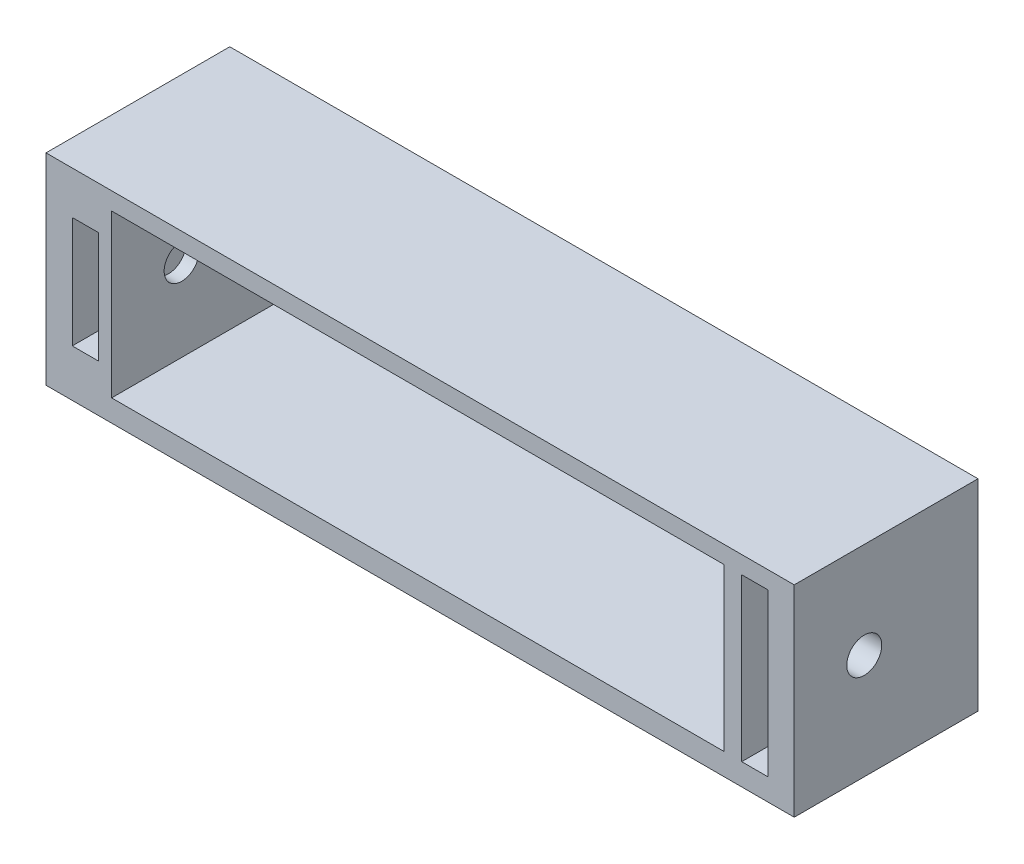
ISO-10303-21;
HEADER;
FILE_DESCRIPTION(('STEP AP214'),'2;1');
FILE_NAME('part.step','',(''),(''),'','','');
FILE_SCHEMA(('AUTOMOTIVE_DESIGN { 1 0 10303 214 1 1 1 1 }'));
ENDSEC;
DATA;
#1=APPLICATION_CONTEXT('core data for automotive mechanical design processes');
#2=APPLICATION_PROTOCOL_DEFINITION('international standard','automotive_design',2000,#1);
#3=PRODUCT_CONTEXT('',#1,'mechanical');
#4=PRODUCT('Part','Part','',(#3));
#5=PRODUCT_RELATED_PRODUCT_CATEGORY('part','',(#4));
#6=PRODUCT_DEFINITION_FORMATION('','',#4);
#7=PRODUCT_DEFINITION_CONTEXT('part definition',#1,'design');
#8=PRODUCT_DEFINITION('design','',#6,#7);
#9=PRODUCT_DEFINITION_SHAPE('','',#8);
#10=(LENGTH_UNIT() NAMED_UNIT(*) SI_UNIT(.MILLI.,.METRE.));
#11=(NAMED_UNIT(*) PLANE_ANGLE_UNIT() SI_UNIT($,.RADIAN.));
#12=(NAMED_UNIT(*) SI_UNIT($,.STERADIAN.) SOLID_ANGLE_UNIT());
#13=UNCERTAINTY_MEASURE_WITH_UNIT(LENGTH_MEASURE(1.E-05),#10,'distance_accuracy_value','');
#14=(GEOMETRIC_REPRESENTATION_CONTEXT(3) GLOBAL_UNCERTAINTY_ASSIGNED_CONTEXT((#13)) GLOBAL_UNIT_ASSIGNED_CONTEXT((#10,
#11,#12)) REPRESENTATION_CONTEXT('',''));
#15=CARTESIAN_POINT('',(0.,0.,0.));
#16=DIRECTION('',(0.,0.,1.));
#17=DIRECTION('',(1.,0.,0.));
#18=AXIS2_PLACEMENT_3D('',#15,#16,#17);
#19=CARTESIAN_POINT('',(34.5,0.,19.));
#20=DIRECTION('',(1.,0.,0.));
#21=DIRECTION('',(0.,0.,-1.));
#22=AXIS2_PLACEMENT_3D('',#19,#20,#21);
#23=PLANE('',#22);
#24=CARTESIAN_POINT('',(34.5,0.282979522502771,11.));
#25=DIRECTION('',(1.,0.,0.));
#26=DIRECTION('',(0.,0.,-1.));
#27=AXIS2_PLACEMENT_3D('',#24,#25,#26);
#28=CIRCLE('',#27,2.);
#29=CARTESIAN_POINT('',(34.5,0.282979522502771,9.));
#30=VERTEX_POINT('',#29);
#31=EDGE_CURVE('E349',#30,#30,#28,.T.);
#32=ORIENTED_EDGE('',*,*,#31,.F.);
#33=EDGE_LOOP('',(#32));
#34=FACE_BOUND('',#33,.T.);
#35=DIRECTION('',(0.,-1.,0.));
#36=VECTOR('',#35,1.);
#37=CARTESIAN_POINT('',(34.5,0.,0.));
#38=LINE('',#37,#36);
#39=CARTESIAN_POINT('',(34.5,9.25000000000001,0.));
#40=VERTEX_POINT('',#39);
#41=CARTESIAN_POINT('',(34.5,-9.25,0.));
#42=VERTEX_POINT('',#41);
#43=EDGE_CURVE('E186',#40,#42,#38,.T.);
#44=ORIENTED_EDGE('',*,*,#43,.F.);
#45=DIRECTION('',(0.,0.,-1.));
#46=VECTOR('',#45,1.);
#47=CARTESIAN_POINT('',(34.5,9.25000000000001,19.));
#48=LINE('',#47,#46);
#49=CARTESIAN_POINT('',(34.5,9.25000000000001,19.));
#50=VERTEX_POINT('',#49);
#51=EDGE_CURVE('E11',#50,#40,#48,.T.);
#52=ORIENTED_EDGE('',*,*,#51,.F.);
#53=DIRECTION('',(0.,-1.,0.));
#54=VECTOR('',#53,1.);
#55=CARTESIAN_POINT('',(34.5,0.,19.));
#56=LINE('',#55,#54);
#57=CARTESIAN_POINT('',(34.5,-9.25,19.));
#58=VERTEX_POINT('',#57);
#59=EDGE_CURVE('E149',#50,#58,#56,.T.);
#60=ORIENTED_EDGE('',*,*,#59,.T.);
#61=DIRECTION('',(0.,0.,-1.));
#62=VECTOR('',#61,1.);
#63=CARTESIAN_POINT('',(34.5,-9.25,19.));
#64=LINE('',#63,#62);
#65=EDGE_CURVE('E87',#58,#42,#64,.T.);
#66=ORIENTED_EDGE('',*,*,#65,.T.);
#67=EDGE_LOOP('',(#44,#52,#60,#66));
#68=FACE_BOUND('',#67,.T.);
#69=ADVANCED_FACE('F35',(#34,#68),#23,.T.);
#70=CARTESIAN_POINT('',(0.,9.25000000000001,19.));
#71=DIRECTION('',(0.,-1.,0.));
#72=DIRECTION('',(1.,0.,0.));
#73=AXIS2_PLACEMENT_3D('',#70,#71,#72);
#74=PLANE('',#73);
#75=DIRECTION('',(-1.,0.,0.));
#76=VECTOR('',#75,1.);
#77=CARTESIAN_POINT('',(0.,9.25000000000001,0.));
#78=LINE('',#77,#76);
#79=CARTESIAN_POINT('',(37.5,9.25000000000002,0.));
#80=VERTEX_POINT('',#79);
#81=EDGE_CURVE('E142',#80,#40,#78,.T.);
#82=ORIENTED_EDGE('',*,*,#81,.F.);
#83=DIRECTION('',(0.,0.,-1.));
#84=VECTOR('',#83,1.);
#85=CARTESIAN_POINT('',(37.5,9.25000000000002,19.));
#86=LINE('',#85,#84);
#87=CARTESIAN_POINT('',(37.5,9.25000000000002,19.));
#88=VERTEX_POINT('',#87);
#89=EDGE_CURVE('E45',#88,#80,#86,.T.);
#90=ORIENTED_EDGE('',*,*,#89,.F.);
#91=DIRECTION('',(-1.,0.,0.));
#92=VECTOR('',#91,1.);
#93=CARTESIAN_POINT('',(0.,9.25000000000001,19.));
#94=LINE('',#93,#92);
#95=EDGE_CURVE('E140',#88,#50,#94,.T.);
#96=ORIENTED_EDGE('',*,*,#95,.T.);
#97=ORIENTED_EDGE('',*,*,#51,.T.);
#98=EDGE_LOOP('',(#82,#90,#96,#97));
#99=FACE_BOUND('',#98,.T.);
#100=ADVANCED_FACE('F139',(#99),#74,.T.);
#101=CARTESIAN_POINT('',(37.5,0.,19.));
#102=DIRECTION('',(-1.,0.,0.));
#103=DIRECTION('',(0.,0.,1.));
#104=AXIS2_PLACEMENT_3D('',#101,#102,#103);
#105=PLANE('',#104);
#106=CARTESIAN_POINT('',(37.5,0.282979522502771,11.));
#107=DIRECTION('',(-1.,0.,0.));
#108=DIRECTION('',(0.,0.,1.));
#109=AXIS2_PLACEMENT_3D('',#106,#107,#108);
#110=CIRCLE('',#109,2.);
#111=CARTESIAN_POINT('',(37.5,0.282979522502771,13.));
#112=VERTEX_POINT('',#111);
#113=EDGE_CURVE('E346',#112,#112,#110,.T.);
#114=ORIENTED_EDGE('',*,*,#113,.F.);
#115=EDGE_LOOP('',(#114));
#116=FACE_BOUND('',#115,.T.);
#117=DIRECTION('',(0.,1.,0.));
#118=VECTOR('',#117,1.);
#119=CARTESIAN_POINT('',(37.5,0.,0.));
#120=LINE('',#119,#118);
#121=CARTESIAN_POINT('',(37.5,-9.25,0.));
#122=VERTEX_POINT('',#121);
#123=EDGE_CURVE('E189',#122,#80,#120,.T.);
#124=ORIENTED_EDGE('',*,*,#123,.F.);
#125=DIRECTION('',(0.,0.,-1.));
#126=VECTOR('',#125,1.);
#127=CARTESIAN_POINT('',(37.5,-9.25,19.));
#128=LINE('',#127,#126);
#129=CARTESIAN_POINT('',(37.5,-9.25,19.));
#130=VERTEX_POINT('',#129);
#131=EDGE_CURVE('E80',#130,#122,#128,.T.);
#132=ORIENTED_EDGE('',*,*,#131,.F.);
#133=DIRECTION('',(0.,1.,0.));
#134=VECTOR('',#133,1.);
#135=CARTESIAN_POINT('',(37.5,0.,19.));
#136=LINE('',#135,#134);
#137=EDGE_CURVE('E148',#130,#88,#136,.T.);
#138=ORIENTED_EDGE('',*,*,#137,.T.);
#139=ORIENTED_EDGE('',*,*,#89,.T.);
#140=EDGE_LOOP('',(#124,#132,#138,#139));
#141=FACE_BOUND('',#140,.T.);
#142=ADVANCED_FACE('F152',(#116,#141),#105,.T.);
#143=CARTESIAN_POINT('',(-45.,0.,19.));
#144=DIRECTION('',(-1.,0.,0.));
#145=DIRECTION('',(0.,-1.,0.));
#146=AXIS2_PLACEMENT_3D('',#143,#144,#145);
#147=PLANE('',#146);
#148=CARTESIAN_POINT('',(-45.,0.282979522502771,11.));
#149=DIRECTION('',(-1.,0.,0.));
#150=DIRECTION('',(0.,-1.,0.));
#151=AXIS2_PLACEMENT_3D('',#148,#149,#150);
#152=CIRCLE('',#151,2.);
#153=CARTESIAN_POINT('',(-45.,-1.71702047749723,11.));
#154=VERTEX_POINT('',#153);
#155=EDGE_CURVE('E338',#154,#154,#152,.T.);
#156=ORIENTED_EDGE('',*,*,#155,.F.);
#157=EDGE_LOOP('',(#156));
#158=FACE_BOUND('',#157,.T.);
#159=DIRECTION('',(0.,0.,-1.));
#160=VECTOR('',#159,1.);
#161=CARTESIAN_POINT('',(-45.,11.25,19.));
#162=LINE('',#161,#160);
#163=CARTESIAN_POINT('',(-45.,11.25,19.));
#164=VERTEX_POINT('',#163);
#165=CARTESIAN_POINT('',(-45.,11.25,-2.));
#166=VERTEX_POINT('',#165);
#167=EDGE_CURVE('E194',#164,#166,#162,.T.);
#168=ORIENTED_EDGE('',*,*,#167,.T.);
#169=DIRECTION('',(0.,1.,0.));
#170=VECTOR('',#169,1.);
#171=CARTESIAN_POINT('',(-45.,11.25,-2.));
#172=LINE('',#171,#170);
#173=CARTESIAN_POINT('',(-45.,-11.75,-2.));
#174=VERTEX_POINT('',#173);
#175=EDGE_CURVE('E358',#174,#166,#172,.T.);
#176=ORIENTED_EDGE('',*,*,#175,.F.);
#177=DIRECTION('',(0.,0.,-1.));
#178=VECTOR('',#177,1.);
#179=CARTESIAN_POINT('',(-45.,-11.75,19.));
#180=LINE('',#179,#178);
#181=CARTESIAN_POINT('',(-45.,-11.75,19.));
#182=VERTEX_POINT('',#181);
#183=EDGE_CURVE('E192',#182,#174,#180,.T.);
#184=ORIENTED_EDGE('',*,*,#183,.F.);
#185=DIRECTION('',(0.,1.,0.));
#186=VECTOR('',#185,1.);
#187=CARTESIAN_POINT('',(-45.,0.,19.));
#188=LINE('',#187,#186);
#189=EDGE_CURVE('E256',#182,#164,#188,.T.);
#190=ORIENTED_EDGE('',*,*,#189,.T.);
#191=EDGE_LOOP('',(#168,#176,#184,#190));
#192=FACE_BOUND('',#191,.T.);
#193=ADVANCED_FACE('F313',(#158,#192),#147,.T.);
#194=CARTESIAN_POINT('',(0.,-11.75,19.));
#195=DIRECTION('',(0.,-1.,0.));
#196=DIRECTION('',(0.,0.,-1.));
#197=AXIS2_PLACEMENT_3D('',#194,#195,#196);
#198=PLANE('',#197);
#199=ORIENTED_EDGE('',*,*,#183,.T.);
#200=DIRECTION('',(-1.,0.,0.));
#201=VECTOR('',#200,1.);
#202=CARTESIAN_POINT('',(40.5,-11.75,-2.));
#203=LINE('',#202,#201);
#204=CARTESIAN_POINT('',(40.5,-11.75,-2.));
#205=VERTEX_POINT('',#204);
#206=EDGE_CURVE('E355',#205,#174,#203,.T.);
#207=ORIENTED_EDGE('',*,*,#206,.F.);
#208=DIRECTION('',(0.,0.,-1.));
#209=VECTOR('',#208,1.);
#210=CARTESIAN_POINT('',(40.5,-11.75,19.));
#211=LINE('',#210,#209);
#212=CARTESIAN_POINT('',(40.5,-11.75,19.));
#213=VERTEX_POINT('',#212);
#214=EDGE_CURVE('E201',#213,#205,#211,.T.);
#215=ORIENTED_EDGE('',*,*,#214,.F.);
#216=DIRECTION('',(-1.,0.,0.));
#217=VECTOR('',#216,1.);
#218=CARTESIAN_POINT('',(0.,-11.75,19.));
#219=LINE('',#218,#217);
#220=EDGE_CURVE('E259',#213,#182,#219,.T.);
#221=ORIENTED_EDGE('',*,*,#220,.T.);
#222=EDGE_LOOP('',(#199,#207,#215,#221));
#223=FACE_BOUND('',#222,.T.);
#224=ADVANCED_FACE('F309',(#223),#198,.T.);
#225=CARTESIAN_POINT('',(40.5,0.,19.));
#226=DIRECTION('',(-1.,0.,0.));
#227=DIRECTION('',(0.,0.,1.));
#228=AXIS2_PLACEMENT_3D('',#225,#226,#227);
#229=PLANE('',#228);
#230=CARTESIAN_POINT('',(40.5,0.282979522502771,11.));
#231=DIRECTION('',(1.,0.,0.));
#232=DIRECTION('',(0.,0.,-1.));
#233=AXIS2_PLACEMENT_3D('',#230,#231,#232);
#234=CIRCLE('',#233,2.);
#235=CARTESIAN_POINT('',(40.5,0.282979522502771,9.));
#236=VERTEX_POINT('',#235);
#237=EDGE_CURVE('E549',#236,#236,#234,.T.);
#238=ORIENTED_EDGE('',*,*,#237,.F.);
#239=EDGE_LOOP('',(#238));
#240=FACE_BOUND('',#239,.T.);
#241=ORIENTED_EDGE('',*,*,#214,.T.);
#242=DIRECTION('',(0.,-1.,0.));
#243=VECTOR('',#242,1.);
#244=CARTESIAN_POINT('',(40.5,11.25,-2.));
#245=LINE('',#244,#243);
#246=CARTESIAN_POINT('',(40.5,11.25,-2.));
#247=VERTEX_POINT('',#246);
#248=EDGE_CURVE('E352',#247,#205,#245,.T.);
#249=ORIENTED_EDGE('',*,*,#248,.F.);
#250=DIRECTION('',(0.,0.,-1.));
#251=VECTOR('',#250,1.);
#252=CARTESIAN_POINT('',(40.5,11.25,19.));
#253=LINE('',#252,#251);
#254=CARTESIAN_POINT('',(40.5,11.25,19.));
#255=VERTEX_POINT('',#254);
#256=EDGE_CURVE('E197',#255,#247,#253,.T.);
#257=ORIENTED_EDGE('',*,*,#256,.F.);
#258=DIRECTION('',(0.,1.,0.));
#259=VECTOR('',#258,1.);
#260=CARTESIAN_POINT('',(40.5,0.,19.));
#261=LINE('',#260,#259);
#262=EDGE_CURVE('E262',#213,#255,#261,.T.);
#263=ORIENTED_EDGE('',*,*,#262,.F.);
#264=EDGE_LOOP('',(#241,#249,#257,#263));
#265=FACE_BOUND('',#264,.T.);
#266=ADVANCED_FACE('F306',(#240,#265),#229,.F.);
#267=CARTESIAN_POINT('',(32.5,9.25000000000001,0.));
#268=VERTEX_POINT('',#267);
#269=CARTESIAN_POINT('',(-37.5,9.25000000000001,0.));
#270=VERTEX_POINT('',#269);
#271=EDGE_CURVE('E173',#268,#270,#78,.T.);
#272=ORIENTED_EDGE('',*,*,#271,.F.);
#273=DIRECTION('',(0.,0.,-1.));
#274=VECTOR('',#273,1.);
#275=CARTESIAN_POINT('',(32.5,9.25000000000001,19.));
#276=LINE('',#275,#274);
#277=CARTESIAN_POINT('',(32.5,9.25000000000001,19.));
#278=VERTEX_POINT('',#277);
#279=EDGE_CURVE('E198',#278,#268,#276,.T.);
#280=ORIENTED_EDGE('',*,*,#279,.F.);
#281=CARTESIAN_POINT('',(-37.5,9.25000000000001,19.));
#282=VERTEX_POINT('',#281);
#283=EDGE_CURVE('E151',#278,#282,#94,.T.);
#284=ORIENTED_EDGE('',*,*,#283,.T.);
#285=DIRECTION('',(0.,0.,-1.));
#286=VECTOR('',#285,1.);
#287=CARTESIAN_POINT('',(-37.5,9.25000000000001,19.));
#288=LINE('',#287,#286);
#289=EDGE_CURVE('E206',#282,#270,#288,.T.);
#290=ORIENTED_EDGE('',*,*,#289,.T.);
#291=EDGE_LOOP('',(#272,#280,#284,#290));
#292=FACE_BOUND('',#291,.T.);
#293=ADVANCED_FACE('F299',(#292),#74,.T.);
#294=CARTESIAN_POINT('',(32.5,0.,19.));
#295=DIRECTION('',(1.,0.,0.));
#296=DIRECTION('',(0.,1.,0.));
#297=AXIS2_PLACEMENT_3D('',#294,#295,#296);
#298=PLANE('',#297);
#299=CARTESIAN_POINT('',(32.5,0.282979522502771,11.));
#300=DIRECTION('',(1.,0.,0.));
#301=DIRECTION('',(0.,1.,0.));
#302=AXIS2_PLACEMENT_3D('',#299,#300,#301);
#303=CIRCLE('',#302,2.);
#304=CARTESIAN_POINT('',(32.5,2.28297952250277,11.));
#305=VERTEX_POINT('',#304);
#306=EDGE_CURVE('E334',#305,#305,#303,.T.);
#307=ORIENTED_EDGE('',*,*,#306,.T.);
#308=EDGE_LOOP('',(#307));
#309=FACE_BOUND('',#308,.T.);
#310=DIRECTION('',(0.,-1.,0.));
#311=VECTOR('',#310,1.);
#312=CARTESIAN_POINT('',(32.5,0.,0.));
#313=LINE('',#312,#311);
#314=CARTESIAN_POINT('',(32.5,-9.25,0.));
#315=VERTEX_POINT('',#314);
#316=EDGE_CURVE('E176',#268,#315,#313,.T.);
#317=ORIENTED_EDGE('',*,*,#316,.T.);
#318=DIRECTION('',(0.,0.,-1.));
#319=VECTOR('',#318,1.);
#320=CARTESIAN_POINT('',(32.5,-9.25,19.));
#321=LINE('',#320,#319);
#322=CARTESIAN_POINT('',(32.5,-9.25,19.));
#323=VERTEX_POINT('',#322);
#324=EDGE_CURVE('E212',#323,#315,#321,.T.);
#325=ORIENTED_EDGE('',*,*,#324,.F.);
#326=DIRECTION('',(0.,-1.,0.));
#327=VECTOR('',#326,1.);
#328=CARTESIAN_POINT('',(32.5,0.,19.));
#329=LINE('',#328,#327);
#330=EDGE_CURVE('E250',#278,#323,#329,.T.);
#331=ORIENTED_EDGE('',*,*,#330,.F.);
#332=ORIENTED_EDGE('',*,*,#279,.T.);
#333=EDGE_LOOP('',(#317,#325,#331,#332));
#334=FACE_BOUND('',#333,.T.);
#335=ADVANCED_FACE('F290',(#309,#334),#298,.F.);
#336=CARTESIAN_POINT('',(0.,-9.25000000000001,19.));
#337=DIRECTION('',(0.,-1.,0.));
#338=DIRECTION('',(1.,0.,0.));
#339=AXIS2_PLACEMENT_3D('',#336,#337,#338);
#340=PLANE('',#339);
#341=DIRECTION('',(-1.,0.,0.));
#342=VECTOR('',#341,1.);
#343=CARTESIAN_POINT('',(0.,-9.25000000000001,0.));
#344=LINE('',#343,#342);
#345=CARTESIAN_POINT('',(-37.5,-9.25000000000001,0.));
#346=VERTEX_POINT('',#345);
#347=EDGE_CURVE('E179',#315,#346,#344,.T.);
#348=ORIENTED_EDGE('',*,*,#347,.T.);
#349=DIRECTION('',(0.,0.,-1.));
#350=VECTOR('',#349,1.);
#351=CARTESIAN_POINT('',(-37.5,-9.25000000000001,19.));
#352=LINE('',#351,#350);
#353=CARTESIAN_POINT('',(-37.5,-9.25000000000001,19.));
#354=VERTEX_POINT('',#353);
#355=EDGE_CURVE('E209',#354,#346,#352,.T.);
#356=ORIENTED_EDGE('',*,*,#355,.F.);
#357=DIRECTION('',(-1.,0.,0.));
#358=VECTOR('',#357,1.);
#359=CARTESIAN_POINT('',(0.,-9.25000000000001,19.));
#360=LINE('',#359,#358);
#361=EDGE_CURVE('E156',#323,#354,#360,.T.);
#362=ORIENTED_EDGE('',*,*,#361,.F.);
#363=ORIENTED_EDGE('',*,*,#324,.T.);
#364=EDGE_LOOP('',(#348,#356,#362,#363));
#365=FACE_BOUND('',#364,.T.);
#366=ADVANCED_FACE('F279',(#365),#340,.F.);
#367=CARTESIAN_POINT('',(0.,6.3557213930348,19.));
#368=DIRECTION('',(0.,-1.,0.));
#369=DIRECTION('',(1.,0.,0.));
#370=AXIS2_PLACEMENT_3D('',#367,#368,#369);
#371=PLANE('',#370);
#372=DIRECTION('',(-1.,0.,0.));
#373=VECTOR('',#372,1.);
#374=CARTESIAN_POINT('',(0.,6.3557213930348,0.));
#375=LINE('',#374,#373);
#376=CARTESIAN_POINT('',(-39.,6.35572139303481,0.));
#377=VERTEX_POINT('',#376);
#378=CARTESIAN_POINT('',(-42.,6.35572139303481,0.));
#379=VERTEX_POINT('',#378);
#380=EDGE_CURVE('E160',#377,#379,#375,.T.);
#381=ORIENTED_EDGE('',*,*,#380,.F.);
#382=DIRECTION('',(0.,0.,-1.));
#383=VECTOR('',#382,1.);
#384=CARTESIAN_POINT('',(-39.,6.35572139303481,19.));
#385=LINE('',#384,#383);
#386=CARTESIAN_POINT('',(-39.,6.35572139303481,19.));
#387=VERTEX_POINT('',#386);
#388=EDGE_CURVE('E95',#387,#377,#385,.T.);
#389=ORIENTED_EDGE('',*,*,#388,.F.);
#390=DIRECTION('',(-1.,0.,0.));
#391=VECTOR('',#390,1.);
#392=CARTESIAN_POINT('',(0.,6.3557213930348,19.));
#393=LINE('',#392,#391);
#394=CARTESIAN_POINT('',(-42.,6.35572139303481,19.));
#395=VERTEX_POINT('',#394);
#396=EDGE_CURVE('E243',#387,#395,#393,.T.);
#397=ORIENTED_EDGE('',*,*,#396,.T.);
#398=DIRECTION('',(0.,0.,-1.));
#399=VECTOR('',#398,1.);
#400=CARTESIAN_POINT('',(-42.,6.35572139303481,19.));
#401=LINE('',#400,#399);
#402=EDGE_CURVE('E154',#395,#379,#401,.T.);
#403=ORIENTED_EDGE('',*,*,#402,.T.);
#404=EDGE_LOOP('',(#381,#389,#397,#403));
#405=FACE_BOUND('',#404,.T.);
#406=ADVANCED_FACE('F37',(#405),#371,.T.);
#407=CARTESIAN_POINT('',(-39.,0.,19.));
#408=DIRECTION('',(-1.,0.,0.));
#409=DIRECTION('',(0.,0.,1.));
#410=AXIS2_PLACEMENT_3D('',#407,#408,#409);
#411=PLANE('',#410);
#412=CARTESIAN_POINT('',(-39.,0.282979522502771,11.));
#413=DIRECTION('',(-1.,0.,0.));
#414=DIRECTION('',(0.,0.,1.));
#415=AXIS2_PLACEMENT_3D('',#412,#413,#414);
#416=CIRCLE('',#415,2.);
#417=CARTESIAN_POINT('',(-39.,0.282979522502771,13.));
#418=VERTEX_POINT('',#417);
#419=EDGE_CURVE('E332',#418,#418,#416,.T.);
#420=ORIENTED_EDGE('',*,*,#419,.F.);
#421=EDGE_LOOP('',(#420));
#422=FACE_BOUND('',#421,.T.);
#423=DIRECTION('',(0.,1.,0.));
#424=VECTOR('',#423,1.);
#425=CARTESIAN_POINT('',(-39.,0.,0.));
#426=LINE('',#425,#424);
#427=CARTESIAN_POINT('',(-39.,-6.35572139303481,0.));
#428=VERTEX_POINT('',#427);
#429=EDGE_CURVE('E163',#428,#377,#426,.T.);
#430=ORIENTED_EDGE('',*,*,#429,.F.);
#431=DIRECTION('',(0.,0.,-1.));
#432=VECTOR('',#431,1.);
#433=CARTESIAN_POINT('',(-39.,-6.35572139303481,19.));
#434=LINE('',#433,#432);
#435=CARTESIAN_POINT('',(-39.,-6.35572139303481,19.));
#436=VERTEX_POINT('',#435);
#437=EDGE_CURVE('E220',#436,#428,#434,.T.);
#438=ORIENTED_EDGE('',*,*,#437,.F.);
#439=DIRECTION('',(0.,1.,0.));
#440=VECTOR('',#439,1.);
#441=CARTESIAN_POINT('',(-39.,0.,19.));
#442=LINE('',#441,#440);
#443=EDGE_CURVE('E227',#436,#387,#442,.T.);
#444=ORIENTED_EDGE('',*,*,#443,.T.);
#445=ORIENTED_EDGE('',*,*,#388,.T.);
#446=EDGE_LOOP('',(#430,#438,#444,#445));
#447=FACE_BOUND('',#446,.T.);
#448=ADVANCED_FACE('F224',(#422,#447),#411,.T.);
#449=CARTESIAN_POINT('',(0.,-6.35572139303481,19.));
#450=DIRECTION('',(0.,-1.,0.));
#451=DIRECTION('',(0.,0.,-1.));
#452=AXIS2_PLACEMENT_3D('',#449,#450,#451);
#453=PLANE('',#452);
#454=DIRECTION('',(-1.,0.,0.));
#455=VECTOR('',#454,1.);
#456=CARTESIAN_POINT('',(0.,-6.35572139303481,0.));
#457=LINE('',#456,#455);
#458=CARTESIAN_POINT('',(-42.,-6.35572139303481,0.));
#459=VERTEX_POINT('',#458);
#460=EDGE_CURVE('E167',#428,#459,#457,.T.);
#461=ORIENTED_EDGE('',*,*,#460,.T.);
#462=DIRECTION('',(0.,0.,-1.));
#463=VECTOR('',#462,1.);
#464=CARTESIAN_POINT('',(-42.,-6.35572139303481,19.));
#465=LINE('',#464,#463);
#466=CARTESIAN_POINT('',(-42.,-6.35572139303481,19.));
#467=VERTEX_POINT('',#466);
#468=EDGE_CURVE('E218',#467,#459,#465,.T.);
#469=ORIENTED_EDGE('',*,*,#468,.F.);
#470=DIRECTION('',(-1.,0.,0.));
#471=VECTOR('',#470,1.);
#472=CARTESIAN_POINT('',(0.,-6.35572139303481,19.));
#473=LINE('',#472,#471);
#474=EDGE_CURVE('E237',#436,#467,#473,.T.);
#475=ORIENTED_EDGE('',*,*,#474,.F.);
#476=ORIENTED_EDGE('',*,*,#437,.T.);
#477=EDGE_LOOP('',(#461,#469,#475,#476));
#478=FACE_BOUND('',#477,.T.);
#479=ADVANCED_FACE('F234',(#478),#453,.F.);
#480=CARTESIAN_POINT('',(0.,11.25,19.));
#481=DIRECTION('',(0.,-1.,0.));
#482=DIRECTION('',(1.,0.,0.));
#483=AXIS2_PLACEMENT_3D('',#480,#481,#482);
#484=PLANE('',#483);
#485=ORIENTED_EDGE('',*,*,#256,.T.);
#486=DIRECTION('',(1.,0.,0.));
#487=VECTOR('',#486,1.);
#488=CARTESIAN_POINT('',(40.5,11.25,-2.));
#489=LINE('',#488,#487);
#490=EDGE_CURVE('E164',#166,#247,#489,.T.);
#491=ORIENTED_EDGE('',*,*,#490,.F.);
#492=ORIENTED_EDGE('',*,*,#167,.F.);
#493=DIRECTION('',(-1.,0.,0.));
#494=VECTOR('',#493,1.);
#495=CARTESIAN_POINT('',(0.,11.25,19.));
#496=LINE('',#495,#494);
#497=EDGE_CURVE('E264',#255,#164,#496,.T.);
#498=ORIENTED_EDGE('',*,*,#497,.F.);
#499=EDGE_LOOP('',(#485,#491,#492,#498));
#500=FACE_BOUND('',#499,.T.);
#501=ADVANCED_FACE('F302',(#500),#484,.F.);
#502=CARTESIAN_POINT('',(-37.5,0.,19.));
#503=DIRECTION('',(-1.,0.,0.));
#504=DIRECTION('',(0.,0.,1.));
#505=AXIS2_PLACEMENT_3D('',#502,#503,#504);
#506=PLANE('',#505);
#507=CARTESIAN_POINT('',(-37.5,0.282979522502771,11.));
#508=DIRECTION('',(-1.,0.,0.));
#509=DIRECTION('',(0.,0.,1.));
#510=AXIS2_PLACEMENT_3D('',#507,#508,#509);
#511=CIRCLE('',#510,2.);
#512=CARTESIAN_POINT('',(-37.5,0.282979522502771,13.));
#513=VERTEX_POINT('',#512);
#514=EDGE_CURVE('E335',#513,#513,#511,.T.);
#515=ORIENTED_EDGE('',*,*,#514,.T.);
#516=EDGE_LOOP('',(#515));
#517=FACE_BOUND('',#516,.T.);
#518=DIRECTION('',(0.,1.,0.));
#519=VECTOR('',#518,1.);
#520=CARTESIAN_POINT('',(-37.5,0.,0.));
#521=LINE('',#520,#519);
#522=EDGE_CURVE('E182',#346,#270,#521,.T.);
#523=ORIENTED_EDGE('',*,*,#522,.T.);
#524=ORIENTED_EDGE('',*,*,#289,.F.);
#525=DIRECTION('',(0.,1.,0.));
#526=VECTOR('',#525,1.);
#527=CARTESIAN_POINT('',(-37.5,0.,19.));
#528=LINE('',#527,#526);
#529=EDGE_CURVE('E254',#354,#282,#528,.T.);
#530=ORIENTED_EDGE('',*,*,#529,.F.);
#531=ORIENTED_EDGE('',*,*,#355,.T.);
#532=EDGE_LOOP('',(#523,#524,#530,#531));
#533=FACE_BOUND('',#532,.T.);
#534=ADVANCED_FACE('F285',(#517,#533),#506,.F.);
#535=CARTESIAN_POINT('',(-42.,0.,19.));
#536=DIRECTION('',(1.,0.,0.));
#537=DIRECTION('',(0.,1.,0.));
#538=AXIS2_PLACEMENT_3D('',#535,#536,#537);
#539=PLANE('',#538);
#540=CARTESIAN_POINT('',(-42.,0.282979522502771,11.));
#541=DIRECTION('',(1.,0.,0.));
#542=DIRECTION('',(0.,1.,0.));
#543=AXIS2_PLACEMENT_3D('',#540,#541,#542);
#544=CIRCLE('',#543,2.);
#545=CARTESIAN_POINT('',(-42.,2.28297952250277,11.));
#546=VERTEX_POINT('',#545);
#547=EDGE_CURVE('E39',#546,#546,#544,.T.);
#548=ORIENTED_EDGE('',*,*,#547,.F.);
#549=EDGE_LOOP('',(#548));
#550=FACE_BOUND('',#549,.T.);
#551=DIRECTION('',(0.,-1.,0.));
#552=VECTOR('',#551,1.);
#553=CARTESIAN_POINT('',(-42.,0.,0.));
#554=LINE('',#553,#552);
#555=EDGE_CURVE('E170',#379,#459,#554,.T.);
#556=ORIENTED_EDGE('',*,*,#555,.F.);
#557=ORIENTED_EDGE('',*,*,#402,.F.);
#558=DIRECTION('',(0.,-1.,0.));
#559=VECTOR('',#558,1.);
#560=CARTESIAN_POINT('',(-42.,0.,19.));
#561=LINE('',#560,#559);
#562=EDGE_CURVE('E240',#395,#467,#561,.T.);
#563=ORIENTED_EDGE('',*,*,#562,.T.);
#564=ORIENTED_EDGE('',*,*,#468,.T.);
#565=EDGE_LOOP('',(#556,#557,#563,#564));
#566=FACE_BOUND('',#565,.T.);
#567=ADVANCED_FACE('F277',(#550,#566),#539,.T.);
#568=EDGE_CURVE('E183',#122,#42,#344,.T.);
#569=ORIENTED_EDGE('',*,*,#568,.T.);
#570=ORIENTED_EDGE('',*,*,#65,.F.);
#571=EDGE_CURVE('E54',#130,#58,#360,.T.);
#572=ORIENTED_EDGE('',*,*,#571,.F.);
#573=ORIENTED_EDGE('',*,*,#131,.T.);
#574=EDGE_LOOP('',(#569,#570,#572,#573));
#575=FACE_BOUND('',#574,.T.);
#576=ADVANCED_FACE('F275',(#575),#340,.F.);
#577=CARTESIAN_POINT('',(0.,0.,19.));
#578=DIRECTION('',(0.,0.,1.));
#579=DIRECTION('',(1.,0.,0.));
#580=AXIS2_PLACEMENT_3D('',#577,#578,#579);
#581=PLANE('',#580);
#582=ORIENTED_EDGE('',*,*,#396,.F.);
#583=ORIENTED_EDGE('',*,*,#443,.F.);
#584=ORIENTED_EDGE('',*,*,#474,.T.);
#585=ORIENTED_EDGE('',*,*,#562,.F.);
#586=EDGE_LOOP('',(#582,#583,#584,#585));
#587=FACE_BOUND('',#586,.T.);
#588=ORIENTED_EDGE('',*,*,#283,.F.);
#589=ORIENTED_EDGE('',*,*,#330,.T.);
#590=ORIENTED_EDGE('',*,*,#361,.T.);
#591=ORIENTED_EDGE('',*,*,#529,.T.);
#592=EDGE_LOOP('',(#588,#589,#590,#591));
#593=FACE_BOUND('',#592,.T.);
#594=ORIENTED_EDGE('',*,*,#189,.F.);
#595=ORIENTED_EDGE('',*,*,#220,.F.);
#596=ORIENTED_EDGE('',*,*,#262,.T.);
#597=ORIENTED_EDGE('',*,*,#497,.T.);
#598=EDGE_LOOP('',(#594,#595,#596,#597));
#599=FACE_BOUND('',#598,.T.);
#600=ORIENTED_EDGE('',*,*,#59,.F.);
#601=ORIENTED_EDGE('',*,*,#95,.F.);
#602=ORIENTED_EDGE('',*,*,#137,.F.);
#603=ORIENTED_EDGE('',*,*,#571,.T.);
#604=EDGE_LOOP('',(#600,#601,#602,#603));
#605=FACE_BOUND('',#604,.T.);
#606=ADVANCED_FACE('F147',(#587,#593,#599,#605),#581,.T.);
#607=CARTESIAN_POINT('',(0.,0.,0.));
#608=DIRECTION('',(0.,0.,-1.));
#609=DIRECTION('',(-1.,0.,0.));
#610=AXIS2_PLACEMENT_3D('',#607,#608,#609);
#611=PLANE('',#610);
#612=ORIENTED_EDGE('',*,*,#81,.T.);
#613=ORIENTED_EDGE('',*,*,#43,.T.);
#614=ORIENTED_EDGE('',*,*,#568,.F.);
#615=ORIENTED_EDGE('',*,*,#123,.T.);
#616=EDGE_LOOP('',(#612,#613,#614,#615));
#617=FACE_BOUND('',#616,.T.);
#618=ADVANCED_FACE('F273',(#617),#611,.F.);
#619=ORIENTED_EDGE('',*,*,#316,.F.);
#620=ORIENTED_EDGE('',*,*,#271,.T.);
#621=ORIENTED_EDGE('',*,*,#522,.F.);
#622=ORIENTED_EDGE('',*,*,#347,.F.);
#623=EDGE_LOOP('',(#619,#620,#621,#622));
#624=FACE_BOUND('',#623,.T.);
#625=ADVANCED_FACE('F386',(#624),#611,.F.);
#626=ORIENTED_EDGE('',*,*,#429,.T.);
#627=ORIENTED_EDGE('',*,*,#380,.T.);
#628=ORIENTED_EDGE('',*,*,#555,.T.);
#629=ORIENTED_EDGE('',*,*,#460,.F.);
#630=EDGE_LOOP('',(#626,#627,#628,#629));
#631=FACE_BOUND('',#630,.T.);
#632=ADVANCED_FACE('F230',(#631),#611,.F.);
#633=CARTESIAN_POINT('',(0.,0.,-2.));
#634=DIRECTION('',(0.,0.,-1.));
#635=DIRECTION('',(-1.,0.,0.));
#636=AXIS2_PLACEMENT_3D('',#633,#634,#635);
#637=PLANE('',#636);
#638=ORIENTED_EDGE('',*,*,#248,.T.);
#639=ORIENTED_EDGE('',*,*,#206,.T.);
#640=ORIENTED_EDGE('',*,*,#175,.T.);
#641=ORIENTED_EDGE('',*,*,#490,.T.);
#642=EDGE_LOOP('',(#638,#639,#640,#641));
#643=FACE_BOUND('',#642,.T.);
#644=ADVANCED_FACE('F364',(#643),#637,.T.);
#645=CARTESIAN_POINT('',(-56.5,0.282979522502771,11.));
#646=DIRECTION('',(1.,0.,0.));
#647=DIRECTION('',(0.,0.,-1.));
#648=AXIS2_PLACEMENT_3D('',#645,#646,#647);
#649=CYLINDRICAL_SURFACE('',#648,2.);
#650=ORIENTED_EDGE('',*,*,#155,.T.);
#651=EDGE_LOOP('',(#650));
#652=FACE_BOUND('',#651,.T.);
#653=ORIENTED_EDGE('',*,*,#547,.T.);
#654=EDGE_LOOP('',(#653));
#655=FACE_BOUND('',#654,.T.);
#656=ADVANCED_FACE('F466',(#652,#655),#649,.F.);
#657=ORIENTED_EDGE('',*,*,#419,.T.);
#658=EDGE_LOOP('',(#657));
#659=FACE_BOUND('',#658,.T.);
#660=ORIENTED_EDGE('',*,*,#514,.F.);
#661=EDGE_LOOP('',(#660));
#662=FACE_BOUND('',#661,.T.);
#663=ADVANCED_FACE('F546',(#659,#662),#649,.F.);
#664=ORIENTED_EDGE('',*,*,#31,.T.);
#665=EDGE_LOOP('',(#664));
#666=FACE_BOUND('',#665,.T.);
#667=ORIENTED_EDGE('',*,*,#306,.F.);
#668=EDGE_LOOP('',(#667));
#669=FACE_BOUND('',#668,.T.);
#670=ADVANCED_FACE('F544',(#666,#669),#649,.F.);
#671=ORIENTED_EDGE('',*,*,#113,.T.);
#672=EDGE_LOOP('',(#671));
#673=FACE_BOUND('',#672,.T.);
#674=ORIENTED_EDGE('',*,*,#237,.T.);
#675=EDGE_LOOP('',(#674));
#676=FACE_BOUND('',#675,.T.);
#677=ADVANCED_FACE('F541',(#673,#676),#649,.F.);
#678=CLOSED_SHELL('',(#69,#100,#142,#193,#224,#266,#293,#335,#366,#406,#448,#479,#501,#534,#567,
#576,#606,#618,#625,#632,#644,#656,#663,#670,#677));
#679=MANIFOLD_SOLID_BREP('B2',#678);
#680=ADVANCED_BREP_SHAPE_REPRESENTATION('',(#18,#679),#14);
#681=SHAPE_DEFINITION_REPRESENTATION(#9,#680);
ENDSEC;
END-ISO-10303-21;
